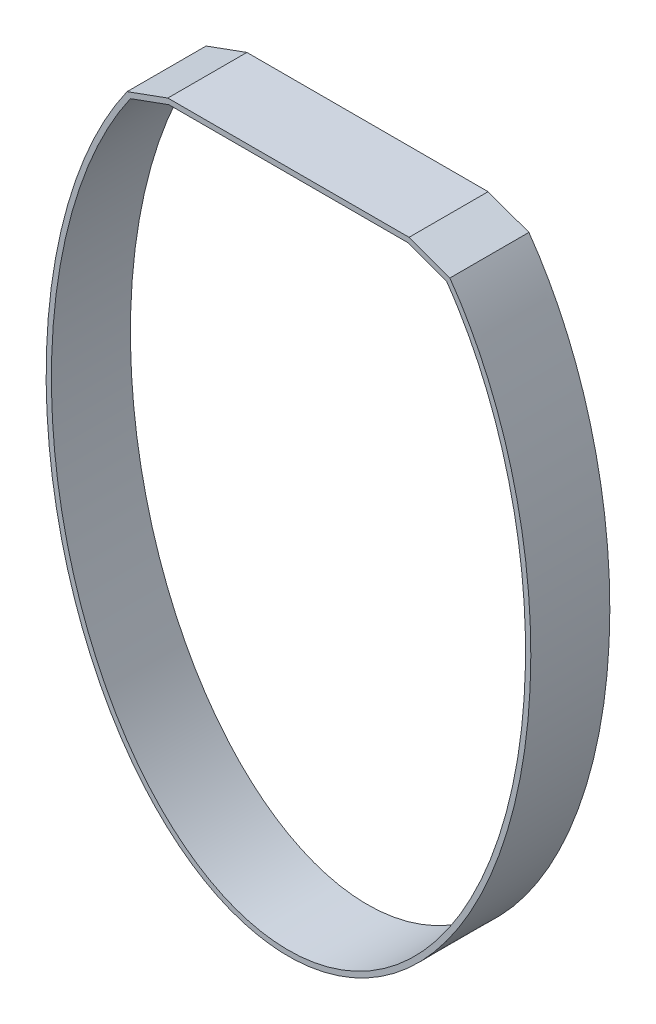
ISO-10303-21;
HEADER;
FILE_DESCRIPTION(('STEP AP214'),'2;1');
FILE_NAME('part.step','',(''),(''),'','','');
FILE_SCHEMA(('AUTOMOTIVE_DESIGN { 1 0 10303 214 1 1 1 1 }'));
ENDSEC;
DATA;
#1=APPLICATION_CONTEXT('core data for automotive mechanical design processes');
#2=APPLICATION_PROTOCOL_DEFINITION('international standard','automotive_design',2000,#1);
#3=PRODUCT_CONTEXT('',#1,'mechanical');
#4=PRODUCT('Part','Part','',(#3));
#5=PRODUCT_RELATED_PRODUCT_CATEGORY('part','',(#4));
#6=PRODUCT_DEFINITION_FORMATION('','',#4);
#7=PRODUCT_DEFINITION_CONTEXT('part definition',#1,'design');
#8=PRODUCT_DEFINITION('design','',#6,#7);
#9=PRODUCT_DEFINITION_SHAPE('','',#8);
#10=(LENGTH_UNIT() NAMED_UNIT(*) SI_UNIT(.MILLI.,.METRE.));
#11=(NAMED_UNIT(*) PLANE_ANGLE_UNIT() SI_UNIT($,.RADIAN.));
#12=(NAMED_UNIT(*) SI_UNIT($,.STERADIAN.) SOLID_ANGLE_UNIT());
#13=UNCERTAINTY_MEASURE_WITH_UNIT(LENGTH_MEASURE(1.E-05),#10,'distance_accuracy_value','');
#14=(GEOMETRIC_REPRESENTATION_CONTEXT(3) GLOBAL_UNCERTAINTY_ASSIGNED_CONTEXT((#13)) GLOBAL_UNIT_ASSIGNED_CONTEXT((#10,
#11,#12)) REPRESENTATION_CONTEXT('',''));
#15=CARTESIAN_POINT('',(0.,0.,0.));
#16=DIRECTION('',(0.,0.,1.));
#17=DIRECTION('',(1.,0.,0.));
#18=AXIS2_PLACEMENT_3D('',#15,#16,#17);
#19=CARTESIAN_POINT('',(7.75331919620733E-13,-257.30209828,15.));
#20=DIRECTION('',(0.,0.,-1.));
#21=DIRECTION('',(-1.,0.,0.));
#22=AXIS2_PLACEMENT_3D('',#19,#20,#21);
#23=PLANE('',#22);
#24=CARTESIAN_POINT('',(-61.2724095142519,-3.63686192550473,15.));
#25=CARTESIAN_POINT('',(-62.1418063612396,-4.86124265327514,15.));
#26=CARTESIAN_POINT('',(-63.8269455959598,-7.32688430715613,15.));
#27=CARTESIAN_POINT('',(-67.0999042062433,-12.4900096320583,15.));
#28=CARTESIAN_POINT('',(-70.9444877912337,-19.2860213292295,15.));
#29=CARTESIAN_POINT('',(-75.1566076364724,-27.9673276963954,15.));
#30=CARTESIAN_POINT('',(-80.2018391558219,-40.169702058476,15.));
#31=CARTESIAN_POINT('',(-85.3891233261054,-56.4755119392975,15.));
#32=CARTESIAN_POINT('',(-89.6881266393751,-77.2884608385368,15.));
#33=CARTESIAN_POINT('',(-91.9684211709126,-98.8809120307434,15.));
#34=CARTESIAN_POINT('',(-92.2545049696078,-128.065641057382,15.));
#35=CARTESIAN_POINT('',(-87.4126180463187,-164.053987534018,15.));
#36=CARTESIAN_POINT('',(-73.7649990649981,-202.605649332181,15.));
#37=CARTESIAN_POINT('',(-53.4465512861733,-233.084958594993,15.));
#38=CARTESIAN_POINT('',(-28.1438581054496,-252.740530127213,15.));
#39=CARTESIAN_POINT('',(7.43329009456062E-13,-259.582882356394,15.));
#40=CARTESIAN_POINT('',(28.143858105451,-252.740530127212,15.));
#41=CARTESIAN_POINT('',(53.4465512861745,-233.084958594991,15.));
#42=CARTESIAN_POINT('',(73.764999064999,-202.605649332179,15.));
#43=CARTESIAN_POINT('',(87.4126180463193,-164.053987534015,15.));
#44=CARTESIAN_POINT('',(92.254504969608,-128.065641057379,15.));
#45=CARTESIAN_POINT('',(91.9684211709125,-98.8809120307411,15.));
#46=CARTESIAN_POINT('',(89.6881266393748,-77.2884608385345,15.));
#47=CARTESIAN_POINT('',(85.3891233261049,-56.4755119392953,15.));
#48=CARTESIAN_POINT('',(80.2018391558213,-40.1697020584739,15.));
#49=CARTESIAN_POINT('',(75.1566076364715,-27.9673276963934,15.));
#50=CARTESIAN_POINT('',(70.9444877912327,-19.2860213292278,15.));
#51=CARTESIAN_POINT('',(67.0999042062423,-12.4900096320565,15.));
#52=CARTESIAN_POINT('',(63.8269455959588,-7.32688430715449,15.));
#53=CARTESIAN_POINT('',(62.1418063612385,-4.86124265327354,15.));
#54=CARTESIAN_POINT('',(61.2724095142508,-3.63686192550316,15.));
#55=B_SPLINE_CURVE_WITH_KNOTS('',3,(#24,#25,#26,#27,#28,#29,#30,#31,#32,#33,#34,#35,#36,#37,#38,
#39,#40,#41,#42,#43,#44,#45,#46,#47,#48,#49,#50,#51,#52,#53,#54),.UNSPECIFIED.,.F.,.F.,(4,1,1,1,
1,1,1,1,1,1,1,1,1,1,1,1,1,1,1,1,1,1,1,1,1,1,1,1,4),(0.72439907742454,0.762167727052122,
0.799936376679705,0.875473675934869,0.951010975190033,1.0265482744452,1.17762287295553,
1.32869747146586,1.47977206997618,1.63084666848651,1.93299586550717,2.23514506252783,
2.53729425954849,2.83944345656914,3.1415926535898,3.44374185061046,3.74589104763112,
4.04804024465177,4.35018944167243,4.65233863869309,4.80341323720342,4.95448783571375,
5.10556243422408,5.2566370327344,5.33217433198957,5.40771163124473,5.4832489304999,
5.52101758012748,5.55878622975506),.UNSPECIFIED.);
#56=CARTESIAN_POINT('',(-61.2724095142519,-3.63686192550473,15.));
#57=VERTEX_POINT('',#56);
#58=CARTESIAN_POINT('',(61.2724095142508,-3.63686192550316,15.));
#59=VERTEX_POINT('',#58);
#60=EDGE_CURVE('E154',#57,#59,#55,.T.);
#61=ORIENTED_EDGE('',*,*,#60,.T.);
#62=DIRECTION('',(-0.939692620031103,0.342020145399479,0.));
#63=VECTOR('',#62,1.);
#64=CARTESIAN_POINT('',(45.7852587636924,2.,15.));
#65=LINE('',#64,#63);
#66=CARTESIAN_POINT('',(45.7852587636924,2.,15.));
#67=VERTEX_POINT('',#66);
#68=EDGE_CURVE('E161',#59,#67,#65,.T.);
#69=ORIENTED_EDGE('',*,*,#68,.T.);
#70=DIRECTION('',(-1.,0.,0.));
#71=VECTOR('',#70,1.);
#72=CARTESIAN_POINT('',(-45.7852587636924,2.,15.));
#73=LINE('',#72,#71);
#74=CARTESIAN_POINT('',(-45.7852587636924,2.,15.));
#75=VERTEX_POINT('',#74);
#76=EDGE_CURVE('E168',#67,#75,#73,.T.);
#77=ORIENTED_EDGE('',*,*,#76,.T.);
#78=DIRECTION('',(-0.93969262003108,-0.342020145399542,0.));
#79=VECTOR('',#78,1.);
#80=CARTESIAN_POINT('',(-45.7852587636924,2.,15.));
#81=LINE('',#80,#79);
#82=EDGE_CURVE('E171',#75,#57,#81,.T.);
#83=ORIENTED_EDGE('',*,*,#82,.T.);
#84=EDGE_LOOP('',(#61,#69,#77,#83));
#85=FACE_BOUND('',#84,.T.);
#86=CARTESIAN_POINT('',(0.,-112.064844061211,15.));
#87=DIRECTION('',(0.,0.,1.));
#88=DIRECTION('',(0.,1.,0.));
#89=AXIS2_PLACEMENT_3D('',#86,#87,#88);
#90=ELLIPSE('',#89,143.237254218789,90.);
#91=CARTESIAN_POINT('',(-60.,-5.30209828,15.));
#92=VERTEX_POINT('',#91);
#93=CARTESIAN_POINT('',(60.,-5.30209828,15.));
#94=VERTEX_POINT('',#93);
#95=EDGE_CURVE('E106',#92,#94,#90,.T.);
#96=ORIENTED_EDGE('',*,*,#95,.F.);
#97=DIRECTION('',(-0.939692620031105,-0.342020145399475,0.));
#98=VECTOR('',#97,1.);
#99=CARTESIAN_POINT('',(-45.4326048,0.,15.));
#100=LINE('',#99,#98);
#101=CARTESIAN_POINT('',(-45.4326048,0.,15.));
#102=VERTEX_POINT('',#101);
#103=EDGE_CURVE('E132',#102,#92,#100,.T.);
#104=ORIENTED_EDGE('',*,*,#103,.F.);
#105=DIRECTION('',(-1.,0.,0.));
#106=VECTOR('',#105,1.);
#107=CARTESIAN_POINT('',(-45.4326048,0.,15.));
#108=LINE('',#107,#106);
#109=CARTESIAN_POINT('',(45.4326048,0.,15.));
#110=VERTEX_POINT('',#109);
#111=EDGE_CURVE('E128',#110,#102,#108,.T.);
#112=ORIENTED_EDGE('',*,*,#111,.F.);
#113=DIRECTION('',(-0.939692620031105,0.342020145399475,0.));
#114=VECTOR('',#113,1.);
#115=CARTESIAN_POINT('',(45.4326048,0.,15.));
#116=LINE('',#115,#114);
#117=EDGE_CURVE('E115',#94,#110,#116,.T.);
#118=ORIENTED_EDGE('',*,*,#117,.F.);
#119=EDGE_LOOP('',(#96,#104,#112,#118));
#120=FACE_BOUND('',#119,.T.);
#121=ADVANCED_FACE('F39',(#85,#120),#23,.F.);
#122=CARTESIAN_POINT('',(7.75331919620733E-13,-257.30209828,-15.));
#123=DIRECTION('',(0.,0.,-1.));
#124=DIRECTION('',(-1.,0.,0.));
#125=AXIS2_PLACEMENT_3D('',#122,#123,#124);
#126=PLANE('',#125);
#127=CARTESIAN_POINT('',(-61.2724095142519,-3.63686192550473,-15.));
#128=CARTESIAN_POINT('',(-62.1418063612396,-4.86124265327514,-15.));
#129=CARTESIAN_POINT('',(-63.8269455959598,-7.32688430715613,-15.));
#130=CARTESIAN_POINT('',(-67.0999042062433,-12.4900096320583,-15.));
#131=CARTESIAN_POINT('',(-70.9444877912337,-19.2860213292295,-15.));
#132=CARTESIAN_POINT('',(-75.1566076364724,-27.9673276963954,-15.));
#133=CARTESIAN_POINT('',(-80.2018391558219,-40.169702058476,-15.));
#134=CARTESIAN_POINT('',(-85.3891233261054,-56.4755119392975,-15.));
#135=CARTESIAN_POINT('',(-89.6881266393751,-77.2884608385368,-15.));
#136=CARTESIAN_POINT('',(-91.9684211709126,-98.8809120307434,-15.));
#137=CARTESIAN_POINT('',(-92.2545049696078,-128.065641057382,-15.));
#138=CARTESIAN_POINT('',(-87.4126180463187,-164.053987534018,-15.));
#139=CARTESIAN_POINT('',(-73.7649990649981,-202.605649332181,-15.));
#140=CARTESIAN_POINT('',(-53.4465512861733,-233.084958594993,-15.));
#141=CARTESIAN_POINT('',(-28.1438581054496,-252.740530127213,-15.));
#142=CARTESIAN_POINT('',(7.43329009456062E-13,-259.582882356394,-15.));
#143=CARTESIAN_POINT('',(28.143858105451,-252.740530127212,-15.));
#144=CARTESIAN_POINT('',(53.4465512861745,-233.084958594991,-15.));
#145=CARTESIAN_POINT('',(73.764999064999,-202.605649332179,-15.));
#146=CARTESIAN_POINT('',(87.4126180463193,-164.053987534015,-15.));
#147=CARTESIAN_POINT('',(92.254504969608,-128.065641057379,-15.));
#148=CARTESIAN_POINT('',(91.9684211709125,-98.8809120307411,-15.));
#149=CARTESIAN_POINT('',(89.6881266393748,-77.2884608385345,-15.));
#150=CARTESIAN_POINT('',(85.3891233261049,-56.4755119392953,-15.));
#151=CARTESIAN_POINT('',(80.2018391558213,-40.1697020584739,-15.));
#152=CARTESIAN_POINT('',(75.1566076364715,-27.9673276963934,-15.));
#153=CARTESIAN_POINT('',(70.9444877912327,-19.2860213292278,-15.));
#154=CARTESIAN_POINT('',(67.0999042062423,-12.4900096320565,-15.));
#155=CARTESIAN_POINT('',(63.8269455959588,-7.32688430715449,-15.));
#156=CARTESIAN_POINT('',(62.1418063612385,-4.86124265327354,-15.));
#157=CARTESIAN_POINT('',(61.2724095142508,-3.63686192550316,-15.));
#158=B_SPLINE_CURVE_WITH_KNOTS('',3,(#127,#128,#129,#130,#131,#132,#133,#134,#135,#136,#137,
#138,#139,#140,#141,#142,#143,#144,#145,#146,#147,#148,#149,#150,#151,#152,#153,#154,#155,#156,
#157),.UNSPECIFIED.,.F.,.F.,(4,1,1,1,1,1,1,1,1,1,1,1,1,1,1,1,1,1,1,1,1,1,1,1,1,1,1,1,4),
(0.72439907742454,0.762167727052122,0.799936376679705,0.875473675934869,0.951010975190033,
1.0265482744452,1.17762287295553,1.32869747146586,1.47977206997618,1.63084666848651,
1.93299586550717,2.23514506252783,2.53729425954849,2.83944345656914,3.1415926535898,
3.44374185061046,3.74589104763112,4.04804024465177,4.35018944167243,4.65233863869309,
4.80341323720342,4.95448783571375,5.10556243422408,5.2566370327344,5.33217433198957,
5.40771163124473,5.4832489304999,5.52101758012748,5.55878622975506),.UNSPECIFIED.);
#159=CARTESIAN_POINT('',(-61.2724095142519,-3.63686192550473,-15.));
#160=VERTEX_POINT('',#159);
#161=CARTESIAN_POINT('',(61.2724095142508,-3.63686192550316,-15.));
#162=VERTEX_POINT('',#161);
#163=EDGE_CURVE('E124',#160,#162,#158,.T.);
#164=ORIENTED_EDGE('',*,*,#163,.F.);
#165=DIRECTION('',(-0.93969262003108,-0.342020145399542,0.));
#166=VECTOR('',#165,1.);
#167=CARTESIAN_POINT('',(-45.7852587636924,2.,-15.));
#168=LINE('',#167,#166);
#169=CARTESIAN_POINT('',(-45.7852587636924,2.,-15.));
#170=VERTEX_POINT('',#169);
#171=EDGE_CURVE('E162',#170,#160,#168,.T.);
#172=ORIENTED_EDGE('',*,*,#171,.F.);
#173=DIRECTION('',(-1.,0.,0.));
#174=VECTOR('',#173,1.);
#175=CARTESIAN_POINT('',(-45.7852587636924,2.,-15.));
#176=LINE('',#175,#174);
#177=CARTESIAN_POINT('',(45.7852587636924,2.,-15.));
#178=VERTEX_POINT('',#177);
#179=EDGE_CURVE('E186',#178,#170,#176,.T.);
#180=ORIENTED_EDGE('',*,*,#179,.F.);
#181=DIRECTION('',(-0.939692620031103,0.342020145399479,0.));
#182=VECTOR('',#181,1.);
#183=CARTESIAN_POINT('',(45.7852587636924,2.,-15.));
#184=LINE('',#183,#182);
#185=EDGE_CURVE('E180',#162,#178,#184,.T.);
#186=ORIENTED_EDGE('',*,*,#185,.F.);
#187=EDGE_LOOP('',(#164,#172,#180,#186));
#188=FACE_BOUND('',#187,.T.);
#189=DIRECTION('',(-0.939692620031105,-0.342020145399475,0.));
#190=VECTOR('',#189,1.);
#191=CARTESIAN_POINT('',(-45.4326048,0.,-15.));
#192=LINE('',#191,#190);
#193=CARTESIAN_POINT('',(-45.4326048,0.,-15.));
#194=VERTEX_POINT('',#193);
#195=CARTESIAN_POINT('',(-60.,-5.30209827999999,-15.));
#196=VERTEX_POINT('',#195);
#197=EDGE_CURVE('E116',#194,#196,#192,.T.);
#198=ORIENTED_EDGE('',*,*,#197,.T.);
#199=CARTESIAN_POINT('',(0.,-112.064844061211,-15.));
#200=DIRECTION('',(0.,0.,1.));
#201=DIRECTION('',(0.,1.,0.));
#202=AXIS2_PLACEMENT_3D('',#199,#200,#201);
#203=ELLIPSE('',#202,143.237254218789,90.);
#204=CARTESIAN_POINT('',(60.,-5.30209828,-15.));
#205=VERTEX_POINT('',#204);
#206=EDGE_CURVE('E64',#196,#205,#203,.T.);
#207=ORIENTED_EDGE('',*,*,#206,.T.);
#208=DIRECTION('',(-0.939692620031105,0.342020145399475,0.));
#209=VECTOR('',#208,1.);
#210=CARTESIAN_POINT('',(45.4326048,0.,-15.));
#211=LINE('',#210,#209);
#212=CARTESIAN_POINT('',(45.4326048,0.,-15.));
#213=VERTEX_POINT('',#212);
#214=EDGE_CURVE('E122',#205,#213,#211,.T.);
#215=ORIENTED_EDGE('',*,*,#214,.T.);
#216=DIRECTION('',(-1.,0.,0.));
#217=VECTOR('',#216,1.);
#218=CARTESIAN_POINT('',(-45.4326048,0.,-15.));
#219=LINE('',#218,#217);
#220=EDGE_CURVE('E142',#213,#194,#219,.T.);
#221=ORIENTED_EDGE('',*,*,#220,.T.);
#222=EDGE_LOOP('',(#198,#207,#215,#221));
#223=FACE_BOUND('',#222,.T.);
#224=ADVANCED_FACE('F209',(#188,#223),#126,.T.);
#225=DIRECTION('',(0.,0.,-1.));
#226=VECTOR('',#225,1.);
#227=SURFACE_OF_LINEAR_EXTRUSION('',#55,#226);
#228=ORIENTED_EDGE('',*,*,#163,.T.);
#229=DIRECTION('',(0.,0.,-1.));
#230=VECTOR('',#229,1.);
#231=CARTESIAN_POINT('',(61.2724095142508,-3.63686192550316,15.));
#232=LINE('',#231,#230);
#233=EDGE_CURVE('E11',#59,#162,#232,.T.);
#234=ORIENTED_EDGE('',*,*,#233,.F.);
#235=ORIENTED_EDGE('',*,*,#60,.F.);
#236=DIRECTION('',(0.,0.,-1.));
#237=VECTOR('',#236,1.);
#238=CARTESIAN_POINT('',(-61.2724095142519,-3.63686192550473,15.));
#239=LINE('',#238,#237);
#240=EDGE_CURVE('E174',#57,#160,#239,.T.);
#241=ORIENTED_EDGE('',*,*,#240,.T.);
#242=EDGE_LOOP('',(#228,#234,#235,#241));
#243=FACE_BOUND('',#242,.T.);
#244=ADVANCED_FACE('F41',(#243),#227,.F.);
#245=CARTESIAN_POINT('',(45.7852587636924,2.,15.));
#246=DIRECTION('',(-0.342020145399479,-0.939692620031103,0.));
#247=DIRECTION('',(0.939692620031103,-0.342020145399479,0.));
#248=AXIS2_PLACEMENT_3D('',#245,#246,#247);
#249=PLANE('',#248);
#250=ORIENTED_EDGE('',*,*,#185,.T.);
#251=DIRECTION('',(0.,0.,-1.));
#252=VECTOR('',#251,1.);
#253=CARTESIAN_POINT('',(45.7852587636924,2.,15.));
#254=LINE('',#253,#252);
#255=EDGE_CURVE('E49',#67,#178,#254,.T.);
#256=ORIENTED_EDGE('',*,*,#255,.F.);
#257=ORIENTED_EDGE('',*,*,#68,.F.);
#258=ORIENTED_EDGE('',*,*,#233,.T.);
#259=EDGE_LOOP('',(#250,#256,#257,#258));
#260=FACE_BOUND('',#259,.T.);
#261=ADVANCED_FACE('F219',(#260),#249,.F.);
#262=CARTESIAN_POINT('',(-45.7852587636924,2.,15.));
#263=DIRECTION('',(0.,-1.,0.));
#264=DIRECTION('',(0.,0.,-1.));
#265=AXIS2_PLACEMENT_3D('',#262,#263,#264);
#266=PLANE('',#265);
#267=ORIENTED_EDGE('',*,*,#179,.T.);
#268=DIRECTION('',(0.,0.,-1.));
#269=VECTOR('',#268,1.);
#270=CARTESIAN_POINT('',(-45.7852587636924,2.,15.));
#271=LINE('',#270,#269);
#272=EDGE_CURVE('E194',#75,#170,#271,.T.);
#273=ORIENTED_EDGE('',*,*,#272,.F.);
#274=ORIENTED_EDGE('',*,*,#76,.F.);
#275=ORIENTED_EDGE('',*,*,#255,.T.);
#276=EDGE_LOOP('',(#267,#273,#274,#275));
#277=FACE_BOUND('',#276,.T.);
#278=ADVANCED_FACE('F203',(#277),#266,.F.);
#279=CARTESIAN_POINT('',(-45.7852587636924,2.,15.));
#280=DIRECTION('',(0.342020145399542,-0.93969262003108,0.));
#281=DIRECTION('',(0.93969262003108,0.342020145399542,0.));
#282=AXIS2_PLACEMENT_3D('',#279,#280,#281);
#283=PLANE('',#282);
#284=ORIENTED_EDGE('',*,*,#171,.T.);
#285=ORIENTED_EDGE('',*,*,#240,.F.);
#286=ORIENTED_EDGE('',*,*,#82,.F.);
#287=ORIENTED_EDGE('',*,*,#272,.T.);
#288=EDGE_LOOP('',(#284,#285,#286,#287));
#289=FACE_BOUND('',#288,.T.);
#290=ADVANCED_FACE('F213',(#289),#283,.F.);
#291=DIRECTION('',(0.,0.,-1.));
#292=VECTOR('',#291,1.);
#293=SURFACE_OF_LINEAR_EXTRUSION('',#90,#292);
#294=ORIENTED_EDGE('',*,*,#206,.F.);
#295=DIRECTION('',(0.,0.,-1.));
#296=VECTOR('',#295,1.);
#297=CARTESIAN_POINT('',(-60.,-5.30209828,15.));
#298=LINE('',#297,#296);
#299=EDGE_CURVE('E110',#92,#196,#298,.T.);
#300=ORIENTED_EDGE('',*,*,#299,.F.);
#301=ORIENTED_EDGE('',*,*,#95,.T.);
#302=DIRECTION('',(0.,0.,-1.));
#303=VECTOR('',#302,1.);
#304=CARTESIAN_POINT('',(60.,-5.30209828,15.));
#305=LINE('',#304,#303);
#306=EDGE_CURVE('E109',#94,#205,#305,.T.);
#307=ORIENTED_EDGE('',*,*,#306,.T.);
#308=EDGE_LOOP('',(#294,#300,#301,#307));
#309=FACE_BOUND('',#308,.T.);
#310=ADVANCED_FACE('F108',(#309),#293,.T.);
#311=CARTESIAN_POINT('',(45.4326048,0.,15.));
#312=DIRECTION('',(-0.342020145399475,-0.939692620031105,0.));
#313=DIRECTION('',(0.939692620031105,-0.342020145399475,0.));
#314=AXIS2_PLACEMENT_3D('',#311,#312,#313);
#315=PLANE('',#314);
#316=ORIENTED_EDGE('',*,*,#214,.F.);
#317=ORIENTED_EDGE('',*,*,#306,.F.);
#318=ORIENTED_EDGE('',*,*,#117,.T.);
#319=DIRECTION('',(0.,0.,-1.));
#320=VECTOR('',#319,1.);
#321=CARTESIAN_POINT('',(45.4326048,0.,15.));
#322=LINE('',#321,#320);
#323=EDGE_CURVE('E125',#110,#213,#322,.T.);
#324=ORIENTED_EDGE('',*,*,#323,.T.);
#325=EDGE_LOOP('',(#316,#317,#318,#324));
#326=FACE_BOUND('',#325,.T.);
#327=ADVANCED_FACE('F119',(#326),#315,.T.);
#328=CARTESIAN_POINT('',(-45.4326048,0.,15.));
#329=DIRECTION('',(0.,-1.,0.));
#330=DIRECTION('',(0.,0.,-1.));
#331=AXIS2_PLACEMENT_3D('',#328,#329,#330);
#332=PLANE('',#331);
#333=ORIENTED_EDGE('',*,*,#220,.F.);
#334=ORIENTED_EDGE('',*,*,#323,.F.);
#335=ORIENTED_EDGE('',*,*,#111,.T.);
#336=DIRECTION('',(0.,0.,-1.));
#337=VECTOR('',#336,1.);
#338=CARTESIAN_POINT('',(-45.4326048,0.,15.));
#339=LINE('',#338,#337);
#340=EDGE_CURVE('E56',#102,#194,#339,.T.);
#341=ORIENTED_EDGE('',*,*,#340,.T.);
#342=EDGE_LOOP('',(#333,#334,#335,#341));
#343=FACE_BOUND('',#342,.T.);
#344=ADVANCED_FACE('F242',(#343),#332,.T.);
#345=CARTESIAN_POINT('',(-45.4326048,0.,15.));
#346=DIRECTION('',(0.342020145399475,-0.939692620031105,0.));
#347=DIRECTION('',(0.939692620031105,0.342020145399475,0.));
#348=AXIS2_PLACEMENT_3D('',#345,#346,#347);
#349=PLANE('',#348);
#350=ORIENTED_EDGE('',*,*,#197,.F.);
#351=ORIENTED_EDGE('',*,*,#340,.F.);
#352=ORIENTED_EDGE('',*,*,#103,.T.);
#353=ORIENTED_EDGE('',*,*,#299,.T.);
#354=EDGE_LOOP('',(#350,#351,#352,#353));
#355=FACE_BOUND('',#354,.T.);
#356=ADVANCED_FACE('F246',(#355),#349,.T.);
#357=CLOSED_SHELL('',(#121,#224,#244,#261,#278,#290,#310,#327,#344,#356));
#358=MANIFOLD_SOLID_BREP('B2',#357);
#359=ADVANCED_BREP_SHAPE_REPRESENTATION('',(#18,#358),#14);
#360=SHAPE_DEFINITION_REPRESENTATION(#9,#359);
ENDSEC;
END-ISO-10303-21;
